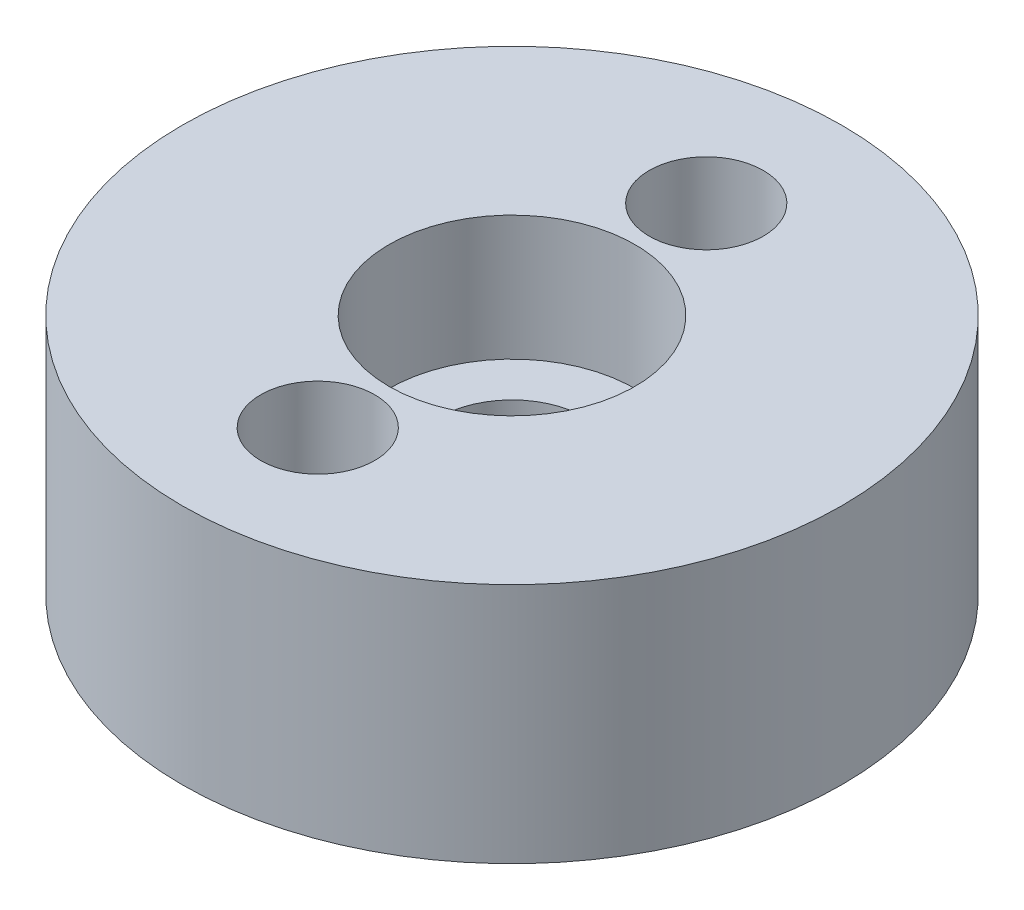
ISO-10303-21;
HEADER;
FILE_DESCRIPTION(('STEP AP214'),'2;1');
FILE_NAME('part.step','',(''),(''),'','','');
FILE_SCHEMA(('AUTOMOTIVE_DESIGN { 1 0 10303 214 1 1 1 1 }'));
ENDSEC;
DATA;
#1=APPLICATION_CONTEXT('core data for automotive mechanical design processes');
#2=APPLICATION_PROTOCOL_DEFINITION('international standard','automotive_design',2000,#1);
#3=PRODUCT_CONTEXT('',#1,'mechanical');
#4=PRODUCT('Part','Part','',(#3));
#5=PRODUCT_RELATED_PRODUCT_CATEGORY('part','',(#4));
#6=PRODUCT_DEFINITION_FORMATION('','',#4);
#7=PRODUCT_DEFINITION_CONTEXT('part definition',#1,'design');
#8=PRODUCT_DEFINITION('design','',#6,#7);
#9=PRODUCT_DEFINITION_SHAPE('','',#8);
#10=(LENGTH_UNIT() NAMED_UNIT(*) SI_UNIT(.MILLI.,.METRE.));
#11=(NAMED_UNIT(*) PLANE_ANGLE_UNIT() SI_UNIT($,.RADIAN.));
#12=(NAMED_UNIT(*) SI_UNIT($,.STERADIAN.) SOLID_ANGLE_UNIT());
#13=UNCERTAINTY_MEASURE_WITH_UNIT(LENGTH_MEASURE(1.E-05),#10,'distance_accuracy_value','');
#14=(GEOMETRIC_REPRESENTATION_CONTEXT(3) GLOBAL_UNCERTAINTY_ASSIGNED_CONTEXT((#13)) GLOBAL_UNIT_ASSIGNED_CONTEXT((#10,
#11,#12)) REPRESENTATION_CONTEXT('',''));
#15=CARTESIAN_POINT('',(0.,0.,0.));
#16=DIRECTION('',(0.,0.,1.));
#17=DIRECTION('',(1.,0.,0.));
#18=AXIS2_PLACEMENT_3D('',#15,#16,#17);
#19=CARTESIAN_POINT('',(0.,6.78,5.45));
#20=DIRECTION('',(0.,-1.,0.));
#21=DIRECTION('',(0.,0.,1.));
#22=AXIS2_PLACEMENT_3D('',#19,#20,#21);
#23=CYLINDRICAL_SURFACE('',#22,1.6);
#24=CARTESIAN_POINT('',(0.,6.78,5.45));
#25=DIRECTION('',(0.,-1.,0.));
#26=DIRECTION('',(0.,0.,1.));
#27=AXIS2_PLACEMENT_3D('',#24,#25,#26);
#28=CIRCLE('',#27,1.6);
#29=CARTESIAN_POINT('',(0.,6.78,7.05));
#30=VERTEX_POINT('',#29);
#31=EDGE_CURVE('E60',#30,#30,#28,.T.);
#32=ORIENTED_EDGE('',*,*,#31,.F.);
#33=EDGE_LOOP('',(#32));
#34=FACE_BOUND('',#33,.T.);
#35=CARTESIAN_POINT('',(0.,3.,5.45));
#36=DIRECTION('',(0.,-1.,0.));
#37=DIRECTION('',(0.,0.,-1.));
#38=AXIS2_PLACEMENT_3D('',#35,#36,#37);
#39=CIRCLE('',#38,1.6);
#40=CARTESIAN_POINT('',(0.,3.,3.85));
#41=VERTEX_POINT('',#40);
#42=EDGE_CURVE('E41',#41,#41,#39,.F.);
#43=ORIENTED_EDGE('',*,*,#42,.F.);
#44=EDGE_LOOP('',(#43));
#45=FACE_BOUND('',#44,.T.);
#46=ADVANCED_FACE('F37',(#34,#45),#23,.F.);
#47=CARTESIAN_POINT('',(0.,6.78,-5.45));
#48=DIRECTION('',(0.,-1.,0.));
#49=DIRECTION('',(0.,0.,-1.));
#50=AXIS2_PLACEMENT_3D('',#47,#48,#49);
#51=CYLINDRICAL_SURFACE('',#50,1.6);
#52=CARTESIAN_POINT('',(0.,6.78,-5.45));
#53=DIRECTION('',(0.,-1.,0.));
#54=DIRECTION('',(0.,0.,-1.));
#55=AXIS2_PLACEMENT_3D('',#52,#53,#54);
#56=CIRCLE('',#55,1.6);
#57=CARTESIAN_POINT('',(0.,6.78,-7.05));
#58=VERTEX_POINT('',#57);
#59=EDGE_CURVE('E65',#58,#58,#56,.T.);
#60=ORIENTED_EDGE('',*,*,#59,.F.);
#61=EDGE_LOOP('',(#60));
#62=FACE_BOUND('',#61,.T.);
#63=CARTESIAN_POINT('',(0.,3.,-5.45));
#64=DIRECTION('',(0.,-1.,0.));
#65=DIRECTION('',(0.,0.,-1.));
#66=AXIS2_PLACEMENT_3D('',#63,#64,#65);
#67=CIRCLE('',#66,1.6);
#68=CARTESIAN_POINT('',(0.,3.,-7.05));
#69=VERTEX_POINT('',#68);
#70=EDGE_CURVE('E58',#69,#69,#67,.F.);
#71=ORIENTED_EDGE('',*,*,#70,.F.);
#72=EDGE_LOOP('',(#71));
#73=FACE_BOUND('',#72,.T.);
#74=ADVANCED_FACE('F104',(#62,#73),#51,.F.);
#75=CARTESIAN_POINT('',(0.,0.,0.));
#76=DIRECTION('',(0.,1.,0.));
#77=DIRECTION('',(0.,0.,1.));
#78=AXIS2_PLACEMENT_3D('',#75,#76,#77);
#79=CYLINDRICAL_SURFACE('',#78,2.05);
#80=CARTESIAN_POINT('',(0.,0.,0.));
#81=DIRECTION('',(0.,1.,0.));
#82=DIRECTION('',(0.,0.,1.));
#83=AXIS2_PLACEMENT_3D('',#80,#81,#82);
#84=CIRCLE('',#83,2.05);
#85=CARTESIAN_POINT('',(0.,0.,2.05));
#86=VERTEX_POINT('',#85);
#87=EDGE_CURVE('E50',#86,#86,#84,.T.);
#88=ORIENTED_EDGE('',*,*,#87,.F.);
#89=EDGE_LOOP('',(#88));
#90=FACE_BOUND('',#89,.T.);
#91=CARTESIAN_POINT('',(0.,3.28,0.));
#92=DIRECTION('',(0.,1.,0.));
#93=DIRECTION('',(0.,0.,1.));
#94=AXIS2_PLACEMENT_3D('',#91,#92,#93);
#95=CIRCLE('',#94,2.05);
#96=CARTESIAN_POINT('',(0.,3.28,2.05));
#97=VERTEX_POINT('',#96);
#98=EDGE_CURVE('E55',#97,#97,#95,.F.);
#99=ORIENTED_EDGE('',*,*,#98,.F.);
#100=EDGE_LOOP('',(#99));
#101=FACE_BOUND('',#100,.T.);
#102=ADVANCED_FACE('F99',(#90,#101),#79,.F.);
#103=CARTESIAN_POINT('',(0.,6.78,0.));
#104=DIRECTION('',(0.,-1.,0.));
#105=DIRECTION('',(0.,0.,-1.));
#106=AXIS2_PLACEMENT_3D('',#103,#104,#105);
#107=CYLINDRICAL_SURFACE('',#106,9.25);
#108=CARTESIAN_POINT('',(0.,6.78,0.));
#109=DIRECTION('',(0.,1.,0.));
#110=DIRECTION('',(0.,0.,1.));
#111=AXIS2_PLACEMENT_3D('',#108,#109,#110);
#112=CIRCLE('',#111,9.25);
#113=CARTESIAN_POINT('',(0.,6.78,9.25));
#114=VERTEX_POINT('',#113);
#115=EDGE_CURVE('E10',#114,#114,#112,.T.);
#116=ORIENTED_EDGE('',*,*,#115,.F.);
#117=EDGE_LOOP('',(#116));
#118=FACE_BOUND('',#117,.T.);
#119=CARTESIAN_POINT('',(0.,0.,0.));
#120=DIRECTION('',(0.,1.,0.));
#121=DIRECTION('',(0.,0.,1.));
#122=AXIS2_PLACEMENT_3D('',#119,#120,#121);
#123=CIRCLE('',#122,9.25);
#124=CARTESIAN_POINT('',(0.,0.,9.25));
#125=VERTEX_POINT('',#124);
#126=EDGE_CURVE('E45',#125,#125,#123,.T.);
#127=ORIENTED_EDGE('',*,*,#126,.T.);
#128=EDGE_LOOP('',(#127));
#129=FACE_BOUND('',#128,.T.);
#130=ADVANCED_FACE('F39',(#118,#129),#107,.T.);
#131=CARTESIAN_POINT('',(0.,6.78,0.));
#132=DIRECTION('',(0.,1.,0.));
#133=DIRECTION('',(0.,0.,1.));
#134=AXIS2_PLACEMENT_3D('',#131,#132,#133);
#135=PLANE('',#134);
#136=ORIENTED_EDGE('',*,*,#31,.T.);
#137=EDGE_LOOP('',(#136));
#138=FACE_BOUND('',#137,.T.);
#139=ORIENTED_EDGE('',*,*,#59,.T.);
#140=EDGE_LOOP('',(#139));
#141=FACE_BOUND('',#140,.T.);
#142=CARTESIAN_POINT('',(0.,6.78,0.));
#143=DIRECTION('',(0.,1.,0.));
#144=DIRECTION('',(0.,0.,1.));
#145=AXIS2_PLACEMENT_3D('',#142,#143,#144);
#146=CIRCLE('',#145,3.45);
#147=CARTESIAN_POINT('',(0.,6.78,3.45));
#148=VERTEX_POINT('',#147);
#149=EDGE_CURVE('E80',#148,#148,#146,.T.);
#150=ORIENTED_EDGE('',*,*,#149,.F.);
#151=EDGE_LOOP('',(#150));
#152=FACE_BOUND('',#151,.T.);
#153=ORIENTED_EDGE('',*,*,#115,.T.);
#154=EDGE_LOOP('',(#153));
#155=FACE_BOUND('',#154,.T.);
#156=ADVANCED_FACE('F87',(#138,#141,#152,#155),#135,.T.);
#157=CARTESIAN_POINT('',(0.,0.,0.));
#158=DIRECTION('',(0.,1.,0.));
#159=DIRECTION('',(0.,0.,1.));
#160=AXIS2_PLACEMENT_3D('',#157,#158,#159);
#161=PLANE('',#160);
#162=CARTESIAN_POINT('',(0.,0.,5.45));
#163=DIRECTION('',(0.,-1.,0.));
#164=DIRECTION('',(0.,0.,1.));
#165=AXIS2_PLACEMENT_3D('',#162,#163,#164);
#166=CIRCLE('',#165,2.75);
#167=CARTESIAN_POINT('',(0.,0.,8.2));
#168=VERTEX_POINT('',#167);
#169=EDGE_CURVE('E215',#168,#168,#166,.T.);
#170=ORIENTED_EDGE('',*,*,#169,.F.);
#171=EDGE_LOOP('',(#170));
#172=FACE_BOUND('',#171,.T.);
#173=CARTESIAN_POINT('',(0.,0.,-5.45));
#174=DIRECTION('',(0.,-1.,0.));
#175=DIRECTION('',(0.,0.,-1.));
#176=AXIS2_PLACEMENT_3D('',#173,#174,#175);
#177=CIRCLE('',#176,2.75);
#178=CARTESIAN_POINT('',(0.,0.,-8.2));
#179=VERTEX_POINT('',#178);
#180=EDGE_CURVE('E68',#179,#179,#177,.T.);
#181=ORIENTED_EDGE('',*,*,#180,.F.);
#182=EDGE_LOOP('',(#181));
#183=FACE_BOUND('',#182,.T.);
#184=ORIENTED_EDGE('',*,*,#87,.T.);
#185=EDGE_LOOP('',(#184));
#186=FACE_BOUND('',#185,.T.);
#187=ORIENTED_EDGE('',*,*,#126,.F.);
#188=EDGE_LOOP('',(#187));
#189=FACE_BOUND('',#188,.T.);
#190=ADVANCED_FACE('F89',(#172,#183,#186,#189),#161,.F.);
#191=CARTESIAN_POINT('',(0.,3.28,0.));
#192=DIRECTION('',(0.,1.,0.));
#193=DIRECTION('',(0.,0.,1.));
#194=AXIS2_PLACEMENT_3D('',#191,#192,#193);
#195=PLANE('',#194);
#196=CARTESIAN_POINT('',(0.,3.28,0.));
#197=DIRECTION('',(0.,1.,0.));
#198=DIRECTION('',(0.,0.,1.));
#199=AXIS2_PLACEMENT_3D('',#196,#197,#198);
#200=CIRCLE('',#199,3.45);
#201=CARTESIAN_POINT('',(0.,3.28,3.45));
#202=VERTEX_POINT('',#201);
#203=EDGE_CURVE('E57',#202,#202,#200,.T.);
#204=ORIENTED_EDGE('',*,*,#203,.T.);
#205=EDGE_LOOP('',(#204));
#206=FACE_BOUND('',#205,.T.);
#207=ORIENTED_EDGE('',*,*,#98,.T.);
#208=EDGE_LOOP('',(#207));
#209=FACE_BOUND('',#208,.T.);
#210=ADVANCED_FACE('F97',(#206,#209),#195,.T.);
#211=CARTESIAN_POINT('',(0.,3.28,0.));
#212=DIRECTION('',(0.,1.,0.));
#213=DIRECTION('',(0.,0.,1.));
#214=AXIS2_PLACEMENT_3D('',#211,#212,#213);
#215=CYLINDRICAL_SURFACE('',#214,3.45);
#216=ORIENTED_EDGE('',*,*,#203,.F.);
#217=EDGE_LOOP('',(#216));
#218=FACE_BOUND('',#217,.T.);
#219=ORIENTED_EDGE('',*,*,#149,.T.);
#220=EDGE_LOOP('',(#219));
#221=FACE_BOUND('',#220,.T.);
#222=ADVANCED_FACE('F85',(#218,#221),#215,.F.);
#223=CARTESIAN_POINT('',(0.,3.,-5.45));
#224=DIRECTION('',(0.,-1.,0.));
#225=DIRECTION('',(0.,0.,-1.));
#226=AXIS2_PLACEMENT_3D('',#223,#224,#225);
#227=PLANE('',#226);
#228=CARTESIAN_POINT('',(0.,3.,-5.45));
#229=DIRECTION('',(0.,-1.,0.));
#230=DIRECTION('',(0.,0.,-1.));
#231=AXIS2_PLACEMENT_3D('',#228,#229,#230);
#232=CIRCLE('',#231,2.75);
#233=CARTESIAN_POINT('',(0.,3.,-8.2));
#234=VERTEX_POINT('',#233);
#235=EDGE_CURVE('E61',#234,#234,#232,.T.);
#236=ORIENTED_EDGE('',*,*,#235,.T.);
#237=EDGE_LOOP('',(#236));
#238=FACE_BOUND('',#237,.T.);
#239=ORIENTED_EDGE('',*,*,#70,.T.);
#240=EDGE_LOOP('',(#239));
#241=FACE_BOUND('',#240,.T.);
#242=ADVANCED_FACE('F123',(#238,#241),#227,.T.);
#243=CARTESIAN_POINT('',(0.,3.,-5.45));
#244=DIRECTION('',(0.,-1.,0.));
#245=DIRECTION('',(0.,0.,-1.));
#246=AXIS2_PLACEMENT_3D('',#243,#244,#245);
#247=CYLINDRICAL_SURFACE('',#246,2.75);
#248=ORIENTED_EDGE('',*,*,#235,.F.);
#249=EDGE_LOOP('',(#248));
#250=FACE_BOUND('',#249,.T.);
#251=ORIENTED_EDGE('',*,*,#180,.T.);
#252=EDGE_LOOP('',(#251));
#253=FACE_BOUND('',#252,.T.);
#254=ADVANCED_FACE('F116',(#250,#253),#247,.F.);
#255=CARTESIAN_POINT('',(0.,3.,5.45));
#256=DIRECTION('',(0.,-1.,0.));
#257=DIRECTION('',(0.,0.,1.));
#258=AXIS2_PLACEMENT_3D('',#255,#256,#257);
#259=PLANE('',#258);
#260=CARTESIAN_POINT('',(0.,3.,5.45));
#261=DIRECTION('',(0.,-1.,0.));
#262=DIRECTION('',(0.,0.,1.));
#263=AXIS2_PLACEMENT_3D('',#260,#261,#262);
#264=CIRCLE('',#263,2.75);
#265=CARTESIAN_POINT('',(0.,3.,8.2));
#266=VERTEX_POINT('',#265);
#267=EDGE_CURVE('E75',#266,#266,#264,.T.);
#268=ORIENTED_EDGE('',*,*,#267,.T.);
#269=EDGE_LOOP('',(#268));
#270=FACE_BOUND('',#269,.T.);
#271=ORIENTED_EDGE('',*,*,#42,.T.);
#272=EDGE_LOOP('',(#271));
#273=FACE_BOUND('',#272,.T.);
#274=ADVANCED_FACE('F183',(#270,#273),#259,.T.);
#275=CARTESIAN_POINT('',(0.,3.,5.45));
#276=DIRECTION('',(0.,-1.,0.));
#277=DIRECTION('',(0.,0.,1.));
#278=AXIS2_PLACEMENT_3D('',#275,#276,#277);
#279=CYLINDRICAL_SURFACE('',#278,2.75);
#280=ORIENTED_EDGE('',*,*,#267,.F.);
#281=EDGE_LOOP('',(#280));
#282=FACE_BOUND('',#281,.T.);
#283=ORIENTED_EDGE('',*,*,#169,.T.);
#284=EDGE_LOOP('',(#283));
#285=FACE_BOUND('',#284,.T.);
#286=ADVANCED_FACE('F195',(#282,#285),#279,.F.);
#287=CLOSED_SHELL('',(#46,#74,#102,#130,#156,#190,#210,#222,#242,#254,#274,#286));
#288=MANIFOLD_SOLID_BREP('B2',#287);
#289=ADVANCED_BREP_SHAPE_REPRESENTATION('',(#18,#288),#14);
#290=SHAPE_DEFINITION_REPRESENTATION(#9,#289);
ENDSEC;
END-ISO-10303-21;
